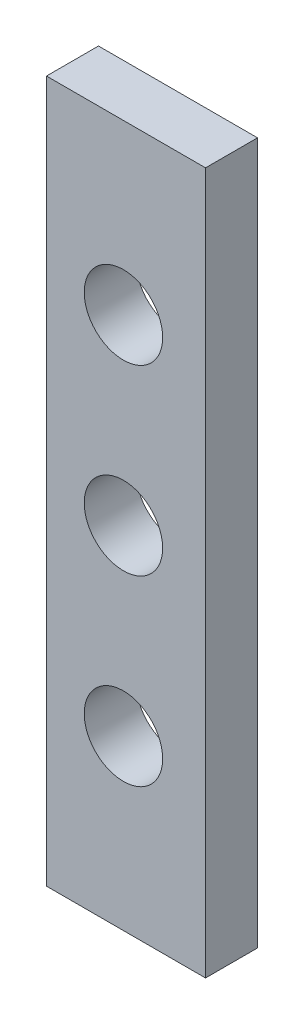
ISO-10303-21;
HEADER;
FILE_DESCRIPTION(('STEP AP214'),'2;1');
FILE_NAME('part.step','',(''),(''),'','','');
FILE_SCHEMA(('AUTOMOTIVE_DESIGN { 1 0 10303 214 1 1 1 1 }'));
ENDSEC;
DATA;
#1=APPLICATION_CONTEXT('core data for automotive mechanical design processes');
#2=APPLICATION_PROTOCOL_DEFINITION('international standard','automotive_design',2000,#1);
#3=PRODUCT_CONTEXT('',#1,'mechanical');
#4=PRODUCT('Part','Part','',(#3));
#5=PRODUCT_RELATED_PRODUCT_CATEGORY('part','',(#4));
#6=PRODUCT_DEFINITION_FORMATION('','',#4);
#7=PRODUCT_DEFINITION_CONTEXT('part definition',#1,'design');
#8=PRODUCT_DEFINITION('design','',#6,#7);
#9=PRODUCT_DEFINITION_SHAPE('','',#8);
#10=(LENGTH_UNIT() NAMED_UNIT(*) SI_UNIT(.MILLI.,.METRE.));
#11=(NAMED_UNIT(*) PLANE_ANGLE_UNIT() SI_UNIT($,.RADIAN.));
#12=(NAMED_UNIT(*) SI_UNIT($,.STERADIAN.) SOLID_ANGLE_UNIT());
#13=UNCERTAINTY_MEASURE_WITH_UNIT(LENGTH_MEASURE(1.E-05),#10,'distance_accuracy_value','');
#14=(GEOMETRIC_REPRESENTATION_CONTEXT(3) GLOBAL_UNCERTAINTY_ASSIGNED_CONTEXT((#13)) GLOBAL_UNIT_ASSIGNED_CONTEXT((#10,
#11,#12)) REPRESENTATION_CONTEXT('',''));
#15=CARTESIAN_POINT('',(0.,0.,0.));
#16=DIRECTION('',(0.,0.,1.));
#17=DIRECTION('',(1.,0.,0.));
#18=AXIS2_PLACEMENT_3D('',#15,#16,#17);
#19=CARTESIAN_POINT('',(-130.,-105.,42.4383510177094));
#20=DIRECTION('',(1.,0.,0.));
#21=DIRECTION('',(0.,0.,-1.));
#22=AXIS2_PLACEMENT_3D('',#19,#20,#21);
#23=PLANE('',#22);
#24=DIRECTION('',(0.,-1.,0.));
#25=VECTOR('',#24,1.);
#26=CARTESIAN_POINT('',(-130.,-105.,2.85000000128499));
#27=LINE('',#26,#25);
#28=CARTESIAN_POINT('',(-130.,-66.5373864405591,2.85000000128499));
#29=VERTEX_POINT('',#28);
#30=CARTESIAN_POINT('',(-130.,-105.,2.85000000128499));
#31=VERTEX_POINT('',#30);
#32=EDGE_CURVE('E85',#29,#31,#27,.T.);
#33=ORIENTED_EDGE('',*,*,#32,.F.);
#34=DIRECTION('',(0.,0.,-1.));
#35=VECTOR('',#34,1.);
#36=CARTESIAN_POINT('',(-130.,-66.5373864405591,42.4383510177094));
#37=LINE('',#36,#35);
#38=CARTESIAN_POINT('',(-130.,-66.5373864405591,0.));
#39=VERTEX_POINT('',#38);
#40=EDGE_CURVE('E51',#29,#39,#37,.T.);
#41=ORIENTED_EDGE('',*,*,#40,.T.);
#42=DIRECTION('',(0.,-1.,0.));
#43=VECTOR('',#42,1.);
#44=CARTESIAN_POINT('',(-130.,-105.,0.));
#45=LINE('',#44,#43);
#46=CARTESIAN_POINT('',(-130.,-105.,0.));
#47=VERTEX_POINT('',#46);
#48=EDGE_CURVE('E83',#39,#47,#45,.T.);
#49=ORIENTED_EDGE('',*,*,#48,.T.);
#50=DIRECTION('',(0.,0.,-1.));
#51=VECTOR('',#50,1.);
#52=CARTESIAN_POINT('',(-130.,-105.,42.4383510177094));
#53=LINE('',#52,#51);
#54=EDGE_CURVE('E74',#31,#47,#53,.T.);
#55=ORIENTED_EDGE('',*,*,#54,.F.);
#56=EDGE_LOOP('',(#33,#41,#49,#55));
#57=FACE_BOUND('',#56,.T.);
#58=ADVANCED_FACE('F34',(#57),#23,.F.);
#59=CARTESIAN_POINT('',(-130.,-105.,42.4383510177094));
#60=DIRECTION('',(0.,1.,0.));
#61=DIRECTION('',(-1.,0.,0.));
#62=AXIS2_PLACEMENT_3D('',#59,#60,#61);
#63=PLANE('',#62);
#64=DIRECTION('',(1.,0.,0.));
#65=VECTOR('',#64,1.);
#66=CARTESIAN_POINT('',(-130.,-105.,2.85000000128499));
#67=LINE('',#66,#65);
#68=CARTESIAN_POINT('',(-121.281577604188,-105.,2.85000000128499));
#69=VERTEX_POINT('',#68);
#70=EDGE_CURVE('E43',#31,#69,#67,.T.);
#71=ORIENTED_EDGE('',*,*,#70,.F.);
#72=ORIENTED_EDGE('',*,*,#54,.T.);
#73=DIRECTION('',(1.,0.,0.));
#74=VECTOR('',#73,1.);
#75=CARTESIAN_POINT('',(-130.,-105.,0.));
#76=LINE('',#75,#74);
#77=CARTESIAN_POINT('',(-121.281577604188,-105.,0.));
#78=VERTEX_POINT('',#77);
#79=EDGE_CURVE('E97',#47,#78,#76,.T.);
#80=ORIENTED_EDGE('',*,*,#79,.T.);
#81=DIRECTION('',(0.,0.,-1.));
#82=VECTOR('',#81,1.);
#83=CARTESIAN_POINT('',(-121.281577604188,-105.,42.4383510177094));
#84=LINE('',#83,#82);
#85=EDGE_CURVE('E106',#69,#78,#84,.T.);
#86=ORIENTED_EDGE('',*,*,#85,.F.);
#87=EDGE_LOOP('',(#71,#72,#80,#86));
#88=FACE_BOUND('',#87,.T.);
#89=ADVANCED_FACE('F129',(#88),#63,.F.);
#90=CARTESIAN_POINT('',(-121.281577604188,-105.,42.4383510177094));
#91=DIRECTION('',(-1.,0.,0.));
#92=DIRECTION('',(0.,-1.,0.));
#93=AXIS2_PLACEMENT_3D('',#90,#91,#92);
#94=PLANE('',#93);
#95=DIRECTION('',(0.,1.,0.));
#96=VECTOR('',#95,1.);
#97=CARTESIAN_POINT('',(-121.281577604188,-105.,2.85000000128499));
#98=LINE('',#97,#96);
#99=CARTESIAN_POINT('',(-121.281577604188,-66.5373864405591,2.85000000128499));
#100=VERTEX_POINT('',#99);
#101=EDGE_CURVE('E12',#69,#100,#98,.T.);
#102=ORIENTED_EDGE('',*,*,#101,.F.);
#103=ORIENTED_EDGE('',*,*,#85,.T.);
#104=DIRECTION('',(0.,1.,0.));
#105=VECTOR('',#104,1.);
#106=CARTESIAN_POINT('',(-121.281577604188,-105.,0.));
#107=LINE('',#106,#105);
#108=CARTESIAN_POINT('',(-121.281577604188,-66.5373864405591,0.));
#109=VERTEX_POINT('',#108);
#110=EDGE_CURVE('E108',#78,#109,#107,.T.);
#111=ORIENTED_EDGE('',*,*,#110,.T.);
#112=DIRECTION('',(0.,0.,-1.));
#113=VECTOR('',#112,1.);
#114=CARTESIAN_POINT('',(-121.281577604188,-66.5373864405591,42.4383510177094));
#115=LINE('',#114,#113);
#116=EDGE_CURVE('E57',#100,#109,#115,.T.);
#117=ORIENTED_EDGE('',*,*,#116,.F.);
#118=EDGE_LOOP('',(#102,#103,#111,#117));
#119=FACE_BOUND('',#118,.T.);
#120=ADVANCED_FACE('F128',(#119),#94,.F.);
#121=CARTESIAN_POINT('',(-130.,-66.5373864405591,42.4383510177094));
#122=DIRECTION('',(0.,-1.,0.));
#123=DIRECTION('',(0.,0.,-1.));
#124=AXIS2_PLACEMENT_3D('',#121,#122,#123);
#125=PLANE('',#124);
#126=DIRECTION('',(-1.,0.,0.));
#127=VECTOR('',#126,1.);
#128=CARTESIAN_POINT('',(-130.,-66.5373864405591,2.85000000128499));
#129=LINE('',#128,#127);
#130=EDGE_CURVE('E94',#100,#29,#129,.T.);
#131=ORIENTED_EDGE('',*,*,#130,.F.);
#132=ORIENTED_EDGE('',*,*,#116,.T.);
#133=DIRECTION('',(-1.,0.,0.));
#134=VECTOR('',#133,1.);
#135=CARTESIAN_POINT('',(-130.,-66.5373864405591,0.));
#136=LINE('',#135,#134);
#137=EDGE_CURVE('E90',#109,#39,#136,.T.);
#138=ORIENTED_EDGE('',*,*,#137,.T.);
#139=ORIENTED_EDGE('',*,*,#40,.F.);
#140=EDGE_LOOP('',(#131,#132,#138,#139));
#141=FACE_BOUND('',#140,.T.);
#142=ADVANCED_FACE('F91',(#141),#125,.F.);
#143=CARTESIAN_POINT('',(0.,0.,0.));
#144=DIRECTION('',(0.,0.,-1.));
#145=DIRECTION('',(-1.,0.,0.));
#146=AXIS2_PLACEMENT_3D('',#143,#144,#145);
#147=PLANE('',#146);
#148=CARTESIAN_POINT('',(-125.781577604187,-95.7686932202796,0.));
#149=DIRECTION('',(0.,0.,-1.));
#150=DIRECTION('',(-1.,0.,0.));
#151=AXIS2_PLACEMENT_3D('',#148,#149,#150);
#152=CIRCLE('',#151,2.15);
#153=CARTESIAN_POINT('',(-127.931577604187,-95.7686932202796,0.));
#154=VERTEX_POINT('',#153);
#155=EDGE_CURVE('E38',#154,#154,#152,.T.);
#156=ORIENTED_EDGE('',*,*,#155,.F.);
#157=EDGE_LOOP('',(#156));
#158=FACE_BOUND('',#157,.T.);
#159=CARTESIAN_POINT('',(-125.781577604187,-85.7686932202796,0.));
#160=DIRECTION('',(0.,0.,-1.));
#161=DIRECTION('',(-1.,0.,0.));
#162=AXIS2_PLACEMENT_3D('',#159,#160,#161);
#163=CIRCLE('',#162,2.15);
#164=CARTESIAN_POINT('',(-127.931577604187,-85.7686932202796,0.));
#165=VERTEX_POINT('',#164);
#166=EDGE_CURVE('E112',#165,#165,#163,.T.);
#167=ORIENTED_EDGE('',*,*,#166,.F.);
#168=EDGE_LOOP('',(#167));
#169=FACE_BOUND('',#168,.T.);
#170=CARTESIAN_POINT('',(-125.781577604187,-75.7686932202796,0.));
#171=DIRECTION('',(0.,0.,-1.));
#172=DIRECTION('',(-1.,0.,0.));
#173=AXIS2_PLACEMENT_3D('',#170,#171,#172);
#174=CIRCLE('',#173,2.15);
#175=CARTESIAN_POINT('',(-127.931577604187,-75.7686932202796,0.));
#176=VERTEX_POINT('',#175);
#177=EDGE_CURVE('E87',#176,#176,#174,.T.);
#178=ORIENTED_EDGE('',*,*,#177,.F.);
#179=EDGE_LOOP('',(#178));
#180=FACE_BOUND('',#179,.T.);
#181=ORIENTED_EDGE('',*,*,#48,.F.);
#182=ORIENTED_EDGE('',*,*,#137,.F.);
#183=ORIENTED_EDGE('',*,*,#110,.F.);
#184=ORIENTED_EDGE('',*,*,#79,.F.);
#185=EDGE_LOOP('',(#181,#182,#183,#184));
#186=FACE_BOUND('',#185,.T.);
#187=ADVANCED_FACE('F96',(#158,#169,#180,#186),#147,.T.);
#188=CARTESIAN_POINT('',(-98.0000000000002,121.642872631566,2.850000001285));
#189=DIRECTION('',(0.,0.,1.));
#190=DIRECTION('',(1.,0.,0.));
#191=AXIS2_PLACEMENT_3D('',#188,#189,#190);
#192=PLANE('',#191);
#193=CARTESIAN_POINT('',(-125.781577604187,-95.7686932202796,2.85000000128499));
#194=DIRECTION('',(0.,0.,1.));
#195=DIRECTION('',(1.,0.,0.));
#196=AXIS2_PLACEMENT_3D('',#193,#194,#195);
#197=CIRCLE('',#196,2.15);
#198=CARTESIAN_POINT('',(-123.631577604187,-95.7686932202796,2.85000000128499));
#199=VERTEX_POINT('',#198);
#200=EDGE_CURVE('E115',#199,#199,#197,.T.);
#201=ORIENTED_EDGE('',*,*,#200,.F.);
#202=EDGE_LOOP('',(#201));
#203=FACE_BOUND('',#202,.T.);
#204=CARTESIAN_POINT('',(-125.781577604187,-85.7686932202796,2.85000000128499));
#205=DIRECTION('',(0.,0.,1.));
#206=DIRECTION('',(1.,0.,0.));
#207=AXIS2_PLACEMENT_3D('',#204,#205,#206);
#208=CIRCLE('',#207,2.15);
#209=CARTESIAN_POINT('',(-123.631577604187,-85.7686932202796,2.85000000128499));
#210=VERTEX_POINT('',#209);
#211=EDGE_CURVE('E113',#210,#210,#208,.T.);
#212=ORIENTED_EDGE('',*,*,#211,.F.);
#213=EDGE_LOOP('',(#212));
#214=FACE_BOUND('',#213,.T.);
#215=CARTESIAN_POINT('',(-125.781577604187,-75.7686932202796,2.85000000128499));
#216=DIRECTION('',(0.,0.,1.));
#217=DIRECTION('',(1.,0.,0.));
#218=AXIS2_PLACEMENT_3D('',#215,#216,#217);
#219=CIRCLE('',#218,2.15);
#220=CARTESIAN_POINT('',(-123.631577604187,-75.7686932202796,2.85000000128499));
#221=VERTEX_POINT('',#220);
#222=EDGE_CURVE('E110',#221,#221,#219,.T.);
#223=ORIENTED_EDGE('',*,*,#222,.F.);
#224=EDGE_LOOP('',(#223));
#225=FACE_BOUND('',#224,.T.);
#226=ORIENTED_EDGE('',*,*,#130,.T.);
#227=ORIENTED_EDGE('',*,*,#32,.T.);
#228=ORIENTED_EDGE('',*,*,#70,.T.);
#229=ORIENTED_EDGE('',*,*,#101,.T.);
#230=EDGE_LOOP('',(#226,#227,#228,#229));
#231=FACE_BOUND('',#230,.T.);
#232=ADVANCED_FACE('F36',(#203,#214,#225,#231),#192,.T.);
#233=CARTESIAN_POINT('',(-125.781577604187,-75.7686932202796,7.00000000128501));
#234=DIRECTION('',(0.,0.,1.));
#235=DIRECTION('',(1.,0.,0.));
#236=AXIS2_PLACEMENT_3D('',#233,#234,#235);
#237=CYLINDRICAL_SURFACE('',#236,2.15);
#238=ORIENTED_EDGE('',*,*,#177,.T.);
#239=EDGE_LOOP('',(#238));
#240=FACE_BOUND('',#239,.T.);
#241=ORIENTED_EDGE('',*,*,#222,.T.);
#242=EDGE_LOOP('',(#241));
#243=FACE_BOUND('',#242,.T.);
#244=ADVANCED_FACE('F143',(#240,#243),#237,.F.);
#245=CARTESIAN_POINT('',(-125.781577604187,-85.7686932202796,7.00000000128501));
#246=DIRECTION('',(0.,0.,1.));
#247=DIRECTION('',(1.,0.,0.));
#248=AXIS2_PLACEMENT_3D('',#245,#246,#247);
#249=CYLINDRICAL_SURFACE('',#248,2.15);
#250=ORIENTED_EDGE('',*,*,#166,.T.);
#251=EDGE_LOOP('',(#250));
#252=FACE_BOUND('',#251,.T.);
#253=ORIENTED_EDGE('',*,*,#211,.T.);
#254=EDGE_LOOP('',(#253));
#255=FACE_BOUND('',#254,.T.);
#256=ADVANCED_FACE('F146',(#252,#255),#249,.F.);
#257=CARTESIAN_POINT('',(-125.781577604187,-95.7686932202796,7.00000000128501));
#258=DIRECTION('',(0.,0.,1.));
#259=DIRECTION('',(1.,0.,0.));
#260=AXIS2_PLACEMENT_3D('',#257,#258,#259);
#261=CYLINDRICAL_SURFACE('',#260,2.15);
#262=ORIENTED_EDGE('',*,*,#200,.T.);
#263=EDGE_LOOP('',(#262));
#264=FACE_BOUND('',#263,.T.);
#265=ORIENTED_EDGE('',*,*,#155,.T.);
#266=EDGE_LOOP('',(#265));
#267=FACE_BOUND('',#266,.T.);
#268=ADVANCED_FACE('F150',(#264,#267),#261,.F.);
#269=CLOSED_SHELL('',(#58,#89,#120,#142,#187,#232,#244,#256,#268));
#270=MANIFOLD_SOLID_BREP('B2',#269);
#271=ADVANCED_BREP_SHAPE_REPRESENTATION('',(#18,#270),#14);
#272=SHAPE_DEFINITION_REPRESENTATION(#9,#271);
ENDSEC;
END-ISO-10303-21;
